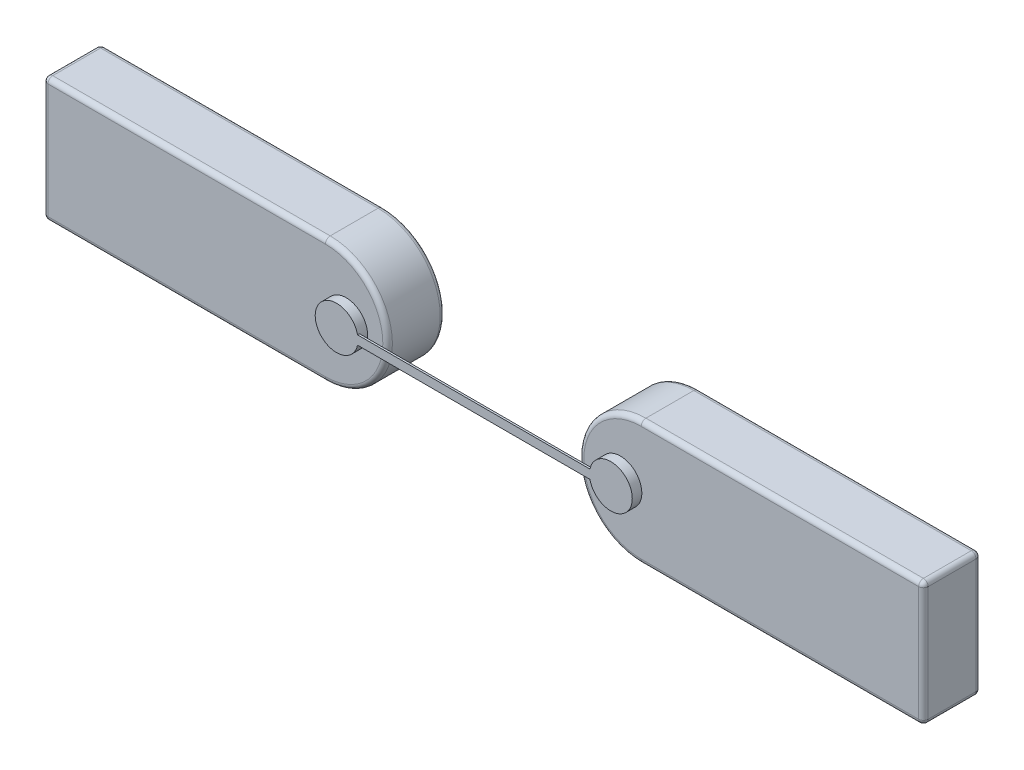
ISO-10303-21;
HEADER;
FILE_DESCRIPTION(('STEP AP214'),'2;1');
FILE_NAME('part.step','',(''),(''),'','','');
FILE_SCHEMA(('AUTOMOTIVE_DESIGN { 1 0 10303 214 1 1 1 1 }'));
ENDSEC;
DATA;
#1=APPLICATION_CONTEXT('core data for automotive mechanical design processes');
#2=APPLICATION_PROTOCOL_DEFINITION('international standard','automotive_design',2000,#1);
#3=PRODUCT_CONTEXT('',#1,'mechanical');
#4=PRODUCT('Part','Part','',(#3));
#5=PRODUCT_RELATED_PRODUCT_CATEGORY('part','',(#4));
#6=PRODUCT_DEFINITION_FORMATION('','',#4);
#7=PRODUCT_DEFINITION_CONTEXT('part definition',#1,'design');
#8=PRODUCT_DEFINITION('design','',#6,#7);
#9=PRODUCT_DEFINITION_SHAPE('','',#8);
#10=(LENGTH_UNIT() NAMED_UNIT(*) SI_UNIT(.MILLI.,.METRE.));
#11=(NAMED_UNIT(*) PLANE_ANGLE_UNIT() SI_UNIT($,.RADIAN.));
#12=(NAMED_UNIT(*) SI_UNIT($,.STERADIAN.) SOLID_ANGLE_UNIT());
#13=UNCERTAINTY_MEASURE_WITH_UNIT(LENGTH_MEASURE(1.E-05),#10,'distance_accuracy_value','');
#14=(GEOMETRIC_REPRESENTATION_CONTEXT(3) GLOBAL_UNCERTAINTY_ASSIGNED_CONTEXT((#13)) GLOBAL_UNIT_ASSIGNED_CONTEXT((#10,
#11,#12)) REPRESENTATION_CONTEXT('',''));
#15=CARTESIAN_POINT('',(0.,0.,0.));
#16=DIRECTION('',(0.,0.,1.));
#17=DIRECTION('',(1.,0.,0.));
#18=AXIS2_PLACEMENT_3D('',#15,#16,#17);
#19=CARTESIAN_POINT('',(2.275,-0.3,0.025));
#20=DIRECTION('',(1.,0.,0.));
#21=DIRECTION('',(0.,1.,0.));
#22=AXIS2_PLACEMENT_3D('',#19,#20,#21);
#23=SPHERICAL_SURFACE('',#22,0.025);
#24=CARTESIAN_POINT('',(2.275,-0.3,0.025));
#25=DIRECTION('',(1.,0.,0.));
#26=DIRECTION('',(0.,1.,0.));
#27=AXIS2_PLACEMENT_3D('',#24,#25,#26);
#28=CIRCLE('',#27,0.025);
#29=CARTESIAN_POINT('',(2.275,-0.3,0.));
#30=VERTEX_POINT('',#29);
#31=CARTESIAN_POINT('',(2.275,-0.325,0.025));
#32=VERTEX_POINT('',#31);
#33=EDGE_CURVE('E186',#30,#32,#28,.F.);
#34=ORIENTED_EDGE('',*,*,#33,.F.);
#35=CARTESIAN_POINT('',(2.275,-0.3,0.025));
#36=DIRECTION('',(0.,1.,0.));
#37=DIRECTION('',(0.,0.,1.));
#38=AXIS2_PLACEMENT_3D('',#35,#36,#37);
#39=CIRCLE('',#38,0.025);
#40=CARTESIAN_POINT('',(2.3,-0.3,0.025));
#41=VERTEX_POINT('',#40);
#42=EDGE_CURVE('E193',#41,#30,#39,.T.);
#43=ORIENTED_EDGE('',*,*,#42,.F.);
#44=CARTESIAN_POINT('',(2.275,-0.3,0.025));
#45=DIRECTION('',(0.,0.,-1.));
#46=DIRECTION('',(-1.,0.,0.));
#47=AXIS2_PLACEMENT_3D('',#44,#45,#46);
#48=CIRCLE('',#47,0.025);
#49=EDGE_CURVE('E226',#32,#41,#48,.F.);
#50=ORIENTED_EDGE('',*,*,#49,.F.);
#51=EDGE_LOOP('',(#34,#43,#50));
#52=FACE_BOUND('',#51,.T.);
#53=ADVANCED_FACE('F17',(#52),#23,.T.);
#54=CARTESIAN_POINT('',(2.275,0.3,0.025));
#55=DIRECTION('',(1.,0.,0.));
#56=DIRECTION('',(0.,0.,1.));
#57=AXIS2_PLACEMENT_3D('',#54,#55,#56);
#58=SPHERICAL_SURFACE('',#57,0.025);
#59=CARTESIAN_POINT('',(2.275,0.3,0.025));
#60=DIRECTION('',(0.,1.,0.));
#61=DIRECTION('',(0.,0.,1.));
#62=AXIS2_PLACEMENT_3D('',#59,#60,#61);
#63=CIRCLE('',#62,0.025);
#64=CARTESIAN_POINT('',(2.275,0.3,0.));
#65=VERTEX_POINT('',#64);
#66=CARTESIAN_POINT('',(2.3,0.3,0.025));
#67=VERTEX_POINT('',#66);
#68=EDGE_CURVE('E230',#65,#67,#63,.F.);
#69=ORIENTED_EDGE('',*,*,#68,.F.);
#70=CARTESIAN_POINT('',(2.275,0.3,0.025));
#71=DIRECTION('',(-1.,0.,0.));
#72=DIRECTION('',(0.,-1.,0.));
#73=AXIS2_PLACEMENT_3D('',#70,#71,#72);
#74=CIRCLE('',#73,0.025);
#75=CARTESIAN_POINT('',(2.275,0.325,0.025));
#76=VERTEX_POINT('',#75);
#77=EDGE_CURVE('E203',#76,#65,#74,.T.);
#78=ORIENTED_EDGE('',*,*,#77,.F.);
#79=CARTESIAN_POINT('',(2.275,0.3,0.025));
#80=DIRECTION('',(0.,0.,-1.));
#81=DIRECTION('',(-1.,0.,0.));
#82=AXIS2_PLACEMENT_3D('',#79,#80,#81);
#83=CIRCLE('',#82,0.025);
#84=EDGE_CURVE('E222',#67,#76,#83,.F.);
#85=ORIENTED_EDGE('',*,*,#84,.F.);
#86=EDGE_LOOP('',(#69,#78,#85));
#87=FACE_BOUND('',#86,.T.);
#88=ADVANCED_FACE('F404',(#87),#58,.T.);
#89=CARTESIAN_POINT('',(1.462069993503,0.,0.));
#90=DIRECTION('',(0.,0.,1.));
#91=DIRECTION('',(1.,0.,0.));
#92=AXIS2_PLACEMENT_3D('',#89,#90,#91);
#93=PLANE('',#92);
#94=DIRECTION('',(-1.,0.,0.));
#95=VECTOR('',#94,1.);
#96=CARTESIAN_POINT('',(1.512284996751,0.3,0.));
#97=LINE('',#96,#95);
#98=CARTESIAN_POINT('',(0.825,0.3,0.));
#99=VERTEX_POINT('',#98);
#100=EDGE_CURVE('E200',#65,#99,#97,.T.);
#101=ORIENTED_EDGE('',*,*,#100,.F.);
#102=DIRECTION('',(0.,1.,0.));
#103=VECTOR('',#102,1.);
#104=CARTESIAN_POINT('',(2.275,0.,0.));
#105=LINE('',#104,#103);
#106=EDGE_CURVE('E190',#30,#65,#105,.T.);
#107=ORIENTED_EDGE('',*,*,#106,.F.);
#108=DIRECTION('',(1.,0.,0.));
#109=VECTOR('',#108,1.);
#110=CARTESIAN_POINT('',(1.512284996751,-0.3,0.));
#111=LINE('',#110,#109);
#112=CARTESIAN_POINT('',(0.825,-0.3,0.));
#113=VERTEX_POINT('',#112);
#114=EDGE_CURVE('E188',#113,#30,#111,.T.);
#115=ORIENTED_EDGE('',*,*,#114,.F.);
#116=CARTESIAN_POINT('',(0.825,0.,0.));
#117=DIRECTION('',(0.,0.,1.));
#118=DIRECTION('',(1.,0.,0.));
#119=AXIS2_PLACEMENT_3D('',#116,#117,#118);
#120=CIRCLE('',#119,0.3);
#121=EDGE_CURVE('E21',#99,#113,#120,.T.);
#122=ORIENTED_EDGE('',*,*,#121,.F.);
#123=EDGE_LOOP('',(#101,#107,#115,#122));
#124=FACE_BOUND('',#123,.T.);
#125=ADVANCED_FACE('F189',(#124),#93,.F.);
#126=CARTESIAN_POINT('',(1.512284996751,-0.3,0.025));
#127=DIRECTION('',(1.,0.,0.));
#128=DIRECTION('',(0.,1.,0.));
#129=AXIS2_PLACEMENT_3D('',#126,#127,#128);
#130=CYLINDRICAL_SURFACE('',#129,0.025);
#131=CARTESIAN_POINT('',(0.825,-0.3,0.025));
#132=DIRECTION('',(-1.,0.,0.));
#133=DIRECTION('',(0.,0.,1.));
#134=AXIS2_PLACEMENT_3D('',#131,#132,#133);
#135=CIRCLE('',#134,0.025);
#136=CARTESIAN_POINT('',(0.825,-0.325,0.025));
#137=VERTEX_POINT('',#136);
#138=EDGE_CURVE('E182',#113,#137,#135,.T.);
#139=ORIENTED_EDGE('',*,*,#138,.F.);
#140=ORIENTED_EDGE('',*,*,#114,.T.);
#141=ORIENTED_EDGE('',*,*,#33,.T.);
#142=DIRECTION('',(1.,0.,0.));
#143=VECTOR('',#142,1.);
#144=CARTESIAN_POINT('',(1.5625,-0.325,0.025));
#145=LINE('',#144,#143);
#146=EDGE_CURVE('E198',#137,#32,#145,.T.);
#147=ORIENTED_EDGE('',*,*,#146,.F.);
#148=EDGE_LOOP('',(#139,#140,#141,#147));
#149=FACE_BOUND('',#148,.T.);
#150=ADVANCED_FACE('F196',(#149),#130,.T.);
#151=CARTESIAN_POINT('',(2.275,0.,0.025));
#152=DIRECTION('',(0.,1.,0.));
#153=DIRECTION('',(0.,0.,1.));
#154=AXIS2_PLACEMENT_3D('',#151,#152,#153);
#155=CYLINDRICAL_SURFACE('',#154,0.025);
#156=ORIENTED_EDGE('',*,*,#68,.T.);
#157=DIRECTION('',(0.,1.,0.));
#158=VECTOR('',#157,1.);
#159=CARTESIAN_POINT('',(2.3,0.,0.025));
#160=LINE('',#159,#158);
#161=EDGE_CURVE('E233',#41,#67,#160,.T.);
#162=ORIENTED_EDGE('',*,*,#161,.F.);
#163=ORIENTED_EDGE('',*,*,#42,.T.);
#164=ORIENTED_EDGE('',*,*,#106,.T.);
#165=EDGE_LOOP('',(#156,#162,#163,#164));
#166=FACE_BOUND('',#165,.T.);
#167=ADVANCED_FACE('F408',(#166),#155,.T.);
#168=CARTESIAN_POINT('',(2.275,-0.3,0.3));
#169=DIRECTION('',(0.,0.,-1.));
#170=DIRECTION('',(-1.,0.,0.));
#171=AXIS2_PLACEMENT_3D('',#168,#169,#170);
#172=CYLINDRICAL_SURFACE('',#171,0.025);
#173=ORIENTED_EDGE('',*,*,#49,.T.);
#174=DIRECTION('',(0.,0.,-1.));
#175=VECTOR('',#174,1.);
#176=CARTESIAN_POINT('',(2.3,-0.3,0.3));
#177=LINE('',#176,#175);
#178=CARTESIAN_POINT('',(2.3,-0.3,0.275));
#179=VERTEX_POINT('',#178);
#180=EDGE_CURVE('E366',#179,#41,#177,.T.);
#181=ORIENTED_EDGE('',*,*,#180,.F.);
#182=CARTESIAN_POINT('',(2.275,-0.3,0.275));
#183=DIRECTION('',(0.,0.,1.));
#184=DIRECTION('',(1.,0.,0.));
#185=AXIS2_PLACEMENT_3D('',#182,#183,#184);
#186=CIRCLE('',#185,0.025);
#187=CARTESIAN_POINT('',(2.275,-0.325,0.275));
#188=VERTEX_POINT('',#187);
#189=EDGE_CURVE('E237',#188,#179,#186,.T.);
#190=ORIENTED_EDGE('',*,*,#189,.F.);
#191=DIRECTION('',(0.,0.,1.));
#192=VECTOR('',#191,1.);
#193=CARTESIAN_POINT('',(2.275,-0.325,0.3));
#194=LINE('',#193,#192);
#195=EDGE_CURVE('E370',#32,#188,#194,.T.);
#196=ORIENTED_EDGE('',*,*,#195,.F.);
#197=EDGE_LOOP('',(#173,#181,#190,#196));
#198=FACE_BOUND('',#197,.T.);
#199=ADVANCED_FACE('F416',(#198),#172,.T.);
#200=CARTESIAN_POINT('',(2.275,0.3,0.3));
#201=DIRECTION('',(0.,0.,-1.));
#202=DIRECTION('',(-1.,0.,0.));
#203=AXIS2_PLACEMENT_3D('',#200,#201,#202);
#204=CYLINDRICAL_SURFACE('',#203,0.025);
#205=ORIENTED_EDGE('',*,*,#84,.T.);
#206=DIRECTION('',(0.,0.,1.));
#207=VECTOR('',#206,1.);
#208=CARTESIAN_POINT('',(2.275,0.325,0.3));
#209=LINE('',#208,#207);
#210=CARTESIAN_POINT('',(2.275,0.325,0.275));
#211=VERTEX_POINT('',#210);
#212=EDGE_CURVE('E217',#211,#76,#209,.F.);
#213=ORIENTED_EDGE('',*,*,#212,.F.);
#214=CARTESIAN_POINT('',(2.275,0.3,0.275));
#215=DIRECTION('',(0.,0.,1.));
#216=DIRECTION('',(1.,0.,0.));
#217=AXIS2_PLACEMENT_3D('',#214,#215,#216);
#218=CIRCLE('',#217,0.025);
#219=CARTESIAN_POINT('',(2.3,0.3,0.275));
#220=VERTEX_POINT('',#219);
#221=EDGE_CURVE('E362',#220,#211,#218,.T.);
#222=ORIENTED_EDGE('',*,*,#221,.F.);
#223=DIRECTION('',(0.,0.,-1.));
#224=VECTOR('',#223,1.);
#225=CARTESIAN_POINT('',(2.3,0.3,0.3));
#226=LINE('',#225,#224);
#227=EDGE_CURVE('E236',#67,#220,#226,.F.);
#228=ORIENTED_EDGE('',*,*,#227,.F.);
#229=EDGE_LOOP('',(#205,#213,#222,#228));
#230=FACE_BOUND('',#229,.T.);
#231=ADVANCED_FACE('F804',(#230),#204,.T.);
#232=CARTESIAN_POINT('',(1.512284996751,0.3,0.025));
#233=DIRECTION('',(-1.,0.,0.));
#234=DIRECTION('',(0.,-1.,0.));
#235=AXIS2_PLACEMENT_3D('',#232,#233,#234);
#236=CYLINDRICAL_SURFACE('',#235,0.025);
#237=CARTESIAN_POINT('',(0.825,0.3,0.025));
#238=DIRECTION('',(-1.,0.,0.));
#239=DIRECTION('',(0.,0.,1.));
#240=AXIS2_PLACEMENT_3D('',#237,#238,#239);
#241=CIRCLE('',#240,0.025);
#242=CARTESIAN_POINT('',(0.825,0.325,0.025));
#243=VERTEX_POINT('',#242);
#244=EDGE_CURVE('E185',#243,#99,#241,.T.);
#245=ORIENTED_EDGE('',*,*,#244,.F.);
#246=DIRECTION('',(-1.,0.,0.));
#247=VECTOR('',#246,1.);
#248=CARTESIAN_POINT('',(1.5625,0.325,0.025));
#249=LINE('',#248,#247);
#250=EDGE_CURVE('E213',#76,#243,#249,.T.);
#251=ORIENTED_EDGE('',*,*,#250,.F.);
#252=ORIENTED_EDGE('',*,*,#77,.T.);
#253=ORIENTED_EDGE('',*,*,#100,.T.);
#254=EDGE_LOOP('',(#245,#251,#252,#253));
#255=FACE_BOUND('',#254,.T.);
#256=ADVANCED_FACE('F400',(#255),#236,.T.);
#257=CARTESIAN_POINT('',(0.825,0.,0.025));
#258=DIRECTION('',(0.,0.,1.));
#259=DIRECTION('',(1.,0.,0.));
#260=AXIS2_PLACEMENT_3D('',#257,#258,#259);
#261=TOROIDAL_SURFACE('',#260,0.3,0.025);
#262=ORIENTED_EDGE('',*,*,#244,.T.);
#263=ORIENTED_EDGE('',*,*,#121,.T.);
#264=ORIENTED_EDGE('',*,*,#138,.T.);
#265=CARTESIAN_POINT('',(0.825,0.,0.025));
#266=DIRECTION('',(0.,0.,-1.));
#267=DIRECTION('',(-1.,0.,0.));
#268=AXIS2_PLACEMENT_3D('',#265,#266,#267);
#269=CIRCLE('',#268,0.325);
#270=EDGE_CURVE('E346',#243,#137,#269,.F.);
#271=ORIENTED_EDGE('',*,*,#270,.F.);
#272=EDGE_LOOP('',(#262,#263,#264,#271));
#273=FACE_BOUND('',#272,.T.);
#274=ADVANCED_FACE('F180',(#273),#261,.T.);
#275=CARTESIAN_POINT('',(1.5625,-0.325,0.3));
#276=DIRECTION('',(0.,-1.,0.));
#277=DIRECTION('',(1.,0.,0.));
#278=AXIS2_PLACEMENT_3D('',#275,#276,#277);
#279=PLANE('',#278);
#280=ORIENTED_EDGE('',*,*,#146,.T.);
#281=ORIENTED_EDGE('',*,*,#195,.T.);
#282=DIRECTION('',(-1.,0.,0.));
#283=VECTOR('',#282,1.);
#284=CARTESIAN_POINT('',(1.512284996751,-0.325,0.275));
#285=LINE('',#284,#283);
#286=CARTESIAN_POINT('',(0.825,-0.325,0.275));
#287=VERTEX_POINT('',#286);
#288=EDGE_CURVE('E328',#287,#188,#285,.F.);
#289=ORIENTED_EDGE('',*,*,#288,.F.);
#290=DIRECTION('',(0.,0.,-1.));
#291=VECTOR('',#290,1.);
#292=CARTESIAN_POINT('',(0.825,-0.325,0.3));
#293=LINE('',#292,#291);
#294=EDGE_CURVE('E337',#137,#287,#293,.F.);
#295=ORIENTED_EDGE('',*,*,#294,.F.);
#296=EDGE_LOOP('',(#280,#281,#289,#295));
#297=FACE_BOUND('',#296,.T.);
#298=ADVANCED_FACE('F423',(#297),#279,.T.);
#299=CARTESIAN_POINT('',(2.275,-0.3,0.275));
#300=DIRECTION('',(1.,0.,0.));
#301=DIRECTION('',(0.,0.,-1.));
#302=AXIS2_PLACEMENT_3D('',#299,#300,#301);
#303=SPHERICAL_SURFACE('',#302,0.0249999999999999);
#304=CARTESIAN_POINT('',(2.275,-0.3,0.275));
#305=DIRECTION('',(-1.,0.,0.));
#306=DIRECTION('',(0.,-1.,0.));
#307=AXIS2_PLACEMENT_3D('',#304,#305,#306);
#308=CIRCLE('',#307,0.025);
#309=CARTESIAN_POINT('',(2.275,-0.3,0.3));
#310=VERTEX_POINT('',#309);
#311=EDGE_CURVE('E335',#188,#310,#308,.T.);
#312=ORIENTED_EDGE('',*,*,#311,.F.);
#313=ORIENTED_EDGE('',*,*,#189,.T.);
#314=CARTESIAN_POINT('',(2.275,-0.3,0.275));
#315=DIRECTION('',(0.,-1.,0.));
#316=DIRECTION('',(0.,0.,-1.));
#317=AXIS2_PLACEMENT_3D('',#314,#315,#316);
#318=CIRCLE('',#317,0.025);
#319=EDGE_CURVE('E327',#310,#179,#318,.F.);
#320=ORIENTED_EDGE('',*,*,#319,.F.);
#321=EDGE_LOOP('',(#312,#313,#320));
#322=FACE_BOUND('',#321,.T.);
#323=ADVANCED_FACE('F435',(#322),#303,.T.);
#324=CARTESIAN_POINT('',(2.3,0.,0.3));
#325=DIRECTION('',(1.,0.,0.));
#326=DIRECTION('',(0.,0.,-1.));
#327=AXIS2_PLACEMENT_3D('',#324,#325,#326);
#328=PLANE('',#327);
#329=DIRECTION('',(0.,-1.,0.));
#330=VECTOR('',#329,1.);
#331=CARTESIAN_POINT('',(2.3,0.,0.275));
#332=LINE('',#331,#330);
#333=EDGE_CURVE('E320',#179,#220,#332,.F.);
#334=ORIENTED_EDGE('',*,*,#333,.F.);
#335=ORIENTED_EDGE('',*,*,#180,.T.);
#336=ORIENTED_EDGE('',*,*,#161,.T.);
#337=ORIENTED_EDGE('',*,*,#227,.T.);
#338=EDGE_LOOP('',(#334,#335,#336,#337));
#339=FACE_BOUND('',#338,.T.);
#340=ADVANCED_FACE('F411',(#339),#328,.T.);
#341=CARTESIAN_POINT('',(2.275,0.3,0.275));
#342=DIRECTION('',(1.,0.,0.));
#343=DIRECTION('',(0.,-1.,0.));
#344=AXIS2_PLACEMENT_3D('',#341,#342,#343);
#345=SPHERICAL_SURFACE('',#344,0.025);
#346=CARTESIAN_POINT('',(2.275,0.3,0.275));
#347=DIRECTION('',(0.,-1.,0.));
#348=DIRECTION('',(0.,0.,-1.));
#349=AXIS2_PLACEMENT_3D('',#346,#347,#348);
#350=CIRCLE('',#349,0.025);
#351=CARTESIAN_POINT('',(2.275,0.3,0.3));
#352=VERTEX_POINT('',#351);
#353=EDGE_CURVE('E325',#220,#352,#350,.T.);
#354=ORIENTED_EDGE('',*,*,#353,.F.);
#355=ORIENTED_EDGE('',*,*,#221,.T.);
#356=CARTESIAN_POINT('',(2.275,0.3,0.275));
#357=DIRECTION('',(1.,0.,0.));
#358=DIRECTION('',(0.,1.,0.));
#359=AXIS2_PLACEMENT_3D('',#356,#357,#358);
#360=CIRCLE('',#359,0.025);
#361=EDGE_CURVE('E317',#352,#211,#360,.F.);
#362=ORIENTED_EDGE('',*,*,#361,.F.);
#363=EDGE_LOOP('',(#354,#355,#362));
#364=FACE_BOUND('',#363,.T.);
#365=ADVANCED_FACE('F440',(#364),#345,.T.);
#366=CARTESIAN_POINT('',(1.5625,0.325,0.3));
#367=DIRECTION('',(0.,1.,0.));
#368=DIRECTION('',(-1.,0.,0.));
#369=AXIS2_PLACEMENT_3D('',#366,#367,#368);
#370=PLANE('',#369);
#371=ORIENTED_EDGE('',*,*,#250,.T.);
#372=DIRECTION('',(0.,0.,-1.));
#373=VECTOR('',#372,1.);
#374=CARTESIAN_POINT('',(0.825,0.325,0.3));
#375=LINE('',#374,#373);
#376=CARTESIAN_POINT('',(0.825,0.325,0.275));
#377=VERTEX_POINT('',#376);
#378=EDGE_CURVE('E216',#377,#243,#375,.T.);
#379=ORIENTED_EDGE('',*,*,#378,.F.);
#380=DIRECTION('',(1.,0.,0.));
#381=VECTOR('',#380,1.);
#382=CARTESIAN_POINT('',(1.512284996751,0.325,0.275));
#383=LINE('',#382,#381);
#384=EDGE_CURVE('E310',#211,#377,#383,.F.);
#385=ORIENTED_EDGE('',*,*,#384,.F.);
#386=ORIENTED_EDGE('',*,*,#212,.T.);
#387=EDGE_LOOP('',(#371,#379,#385,#386));
#388=FACE_BOUND('',#387,.T.);
#389=ADVANCED_FACE('F395',(#388),#370,.T.);
#390=CARTESIAN_POINT('',(0.825,0.,0.3));
#391=DIRECTION('',(0.,0.,-1.));
#392=DIRECTION('',(-1.,0.,0.));
#393=AXIS2_PLACEMENT_3D('',#390,#391,#392);
#394=CYLINDRICAL_SURFACE('',#393,0.325);
#395=ORIENTED_EDGE('',*,*,#270,.T.);
#396=ORIENTED_EDGE('',*,*,#294,.T.);
#397=CARTESIAN_POINT('',(0.825,0.,0.275));
#398=DIRECTION('',(0.,0.,1.));
#399=DIRECTION('',(1.,0.,0.));
#400=AXIS2_PLACEMENT_3D('',#397,#398,#399);
#401=CIRCLE('',#400,0.325);
#402=EDGE_CURVE('E304',#377,#287,#401,.T.);
#403=ORIENTED_EDGE('',*,*,#402,.F.);
#404=ORIENTED_EDGE('',*,*,#378,.T.);
#405=EDGE_LOOP('',(#395,#396,#403,#404));
#406=FACE_BOUND('',#405,.T.);
#407=ADVANCED_FACE('F390',(#406),#394,.T.);
#408=CARTESIAN_POINT('',(1.512284996751,-0.3,0.275));
#409=DIRECTION('',(-1.,0.,0.));
#410=DIRECTION('',(0.,-1.,0.));
#411=AXIS2_PLACEMENT_3D('',#408,#409,#410);
#412=CYLINDRICAL_SURFACE('',#411,0.025);
#413=CARTESIAN_POINT('',(0.825,-0.3,0.275));
#414=DIRECTION('',(-1.,0.,0.));
#415=DIRECTION('',(0.,0.,1.));
#416=AXIS2_PLACEMENT_3D('',#413,#414,#415);
#417=CIRCLE('',#416,0.025);
#418=CARTESIAN_POINT('',(0.825,-0.3,0.3));
#419=VERTEX_POINT('',#418);
#420=EDGE_CURVE('E307',#287,#419,#417,.T.);
#421=ORIENTED_EDGE('',*,*,#420,.F.);
#422=ORIENTED_EDGE('',*,*,#288,.T.);
#423=ORIENTED_EDGE('',*,*,#311,.T.);
#424=DIRECTION('',(1.,0.,0.));
#425=VECTOR('',#424,1.);
#426=CARTESIAN_POINT('',(1.462069993503,-0.3,0.3));
#427=LINE('',#426,#425);
#428=EDGE_CURVE('E296',#419,#310,#427,.T.);
#429=ORIENTED_EDGE('',*,*,#428,.F.);
#430=EDGE_LOOP('',(#421,#422,#423,#429));
#431=FACE_BOUND('',#430,.T.);
#432=ADVANCED_FACE('F429',(#431),#412,.T.);
#433=CARTESIAN_POINT('',(2.275,0.,0.275));
#434=DIRECTION('',(0.,-1.,0.));
#435=DIRECTION('',(0.,0.,-1.));
#436=AXIS2_PLACEMENT_3D('',#433,#434,#435);
#437=CYLINDRICAL_SURFACE('',#436,0.025);
#438=ORIENTED_EDGE('',*,*,#319,.T.);
#439=ORIENTED_EDGE('',*,*,#333,.T.);
#440=ORIENTED_EDGE('',*,*,#353,.T.);
#441=DIRECTION('',(0.,1.,0.));
#442=VECTOR('',#441,1.);
#443=CARTESIAN_POINT('',(2.275,0.,0.3));
#444=LINE('',#443,#442);
#445=EDGE_CURVE('E291',#310,#352,#444,.T.);
#446=ORIENTED_EDGE('',*,*,#445,.F.);
#447=EDGE_LOOP('',(#438,#439,#440,#446));
#448=FACE_BOUND('',#447,.T.);
#449=ADVANCED_FACE('F437',(#448),#437,.T.);
#450=CARTESIAN_POINT('',(1.512284996751,0.3,0.275));
#451=DIRECTION('',(1.,0.,0.));
#452=DIRECTION('',(0.,1.,0.));
#453=AXIS2_PLACEMENT_3D('',#450,#451,#452);
#454=CYLINDRICAL_SURFACE('',#453,0.025);
#455=CARTESIAN_POINT('',(0.825,0.3,0.275));
#456=DIRECTION('',(-1.,0.,0.));
#457=DIRECTION('',(0.,0.,1.));
#458=AXIS2_PLACEMENT_3D('',#455,#456,#457);
#459=CIRCLE('',#458,0.025);
#460=CARTESIAN_POINT('',(0.825,0.3,0.3));
#461=VERTEX_POINT('',#460);
#462=EDGE_CURVE('E309',#461,#377,#459,.T.);
#463=ORIENTED_EDGE('',*,*,#462,.F.);
#464=DIRECTION('',(1.,0.,0.));
#465=VECTOR('',#464,1.);
#466=CARTESIAN_POINT('',(1.462069993503,0.3,0.3));
#467=LINE('',#466,#465);
#468=EDGE_CURVE('E286',#352,#461,#467,.F.);
#469=ORIENTED_EDGE('',*,*,#468,.F.);
#470=ORIENTED_EDGE('',*,*,#361,.T.);
#471=ORIENTED_EDGE('',*,*,#384,.T.);
#472=EDGE_LOOP('',(#463,#469,#470,#471));
#473=FACE_BOUND('',#472,.T.);
#474=ADVANCED_FACE('F442',(#473),#454,.T.);
#475=CARTESIAN_POINT('',(0.825,0.,0.275));
#476=DIRECTION('',(0.,0.,-1.));
#477=DIRECTION('',(-1.,0.,0.));
#478=AXIS2_PLACEMENT_3D('',#475,#476,#477);
#479=TOROIDAL_SURFACE('',#478,0.3,0.025);
#480=ORIENTED_EDGE('',*,*,#462,.T.);
#481=ORIENTED_EDGE('',*,*,#402,.T.);
#482=ORIENTED_EDGE('',*,*,#420,.T.);
#483=CARTESIAN_POINT('',(0.825,0.,0.3));
#484=DIRECTION('',(0.,0.,-1.));
#485=DIRECTION('',(-1.,0.,0.));
#486=AXIS2_PLACEMENT_3D('',#483,#484,#485);
#487=CIRCLE('',#486,0.3);
#488=EDGE_CURVE('E284',#461,#419,#487,.F.);
#489=ORIENTED_EDGE('',*,*,#488,.F.);
#490=EDGE_LOOP('',(#480,#481,#482,#489));
#491=FACE_BOUND('',#490,.T.);
#492=ADVANCED_FACE('F428',(#491),#479,.T.);
#493=CARTESIAN_POINT('',(1.462069993503,0.,0.3));
#494=DIRECTION('',(0.,0.,1.));
#495=DIRECTION('',(1.,0.,0.));
#496=AXIS2_PLACEMENT_3D('',#493,#494,#495);
#497=PLANE('',#496);
#498=CARTESIAN_POINT('',(0.716666728258,0.,0.3));
#499=DIRECTION('',(0.,0.,1.));
#500=DIRECTION('',(0.,-1.,0.));
#501=AXIS2_PLACEMENT_3D('',#498,#499,#500);
#502=CIRCLE('',#501,0.111803283921);
#503=CARTESIAN_POINT('',(0.716666728258,-0.111803283921,0.3));
#504=VERTEX_POINT('',#503);
#505=EDGE_CURVE('E282',#504,#504,#502,.T.);
#506=ORIENTED_EDGE('',*,*,#505,.F.);
#507=EDGE_LOOP('',(#506));
#508=FACE_BOUND('',#507,.T.);
#509=ORIENTED_EDGE('',*,*,#468,.T.);
#510=ORIENTED_EDGE('',*,*,#488,.T.);
#511=ORIENTED_EDGE('',*,*,#428,.T.);
#512=ORIENTED_EDGE('',*,*,#445,.T.);
#513=EDGE_LOOP('',(#509,#510,#511,#512));
#514=FACE_BOUND('',#513,.T.);
#515=ADVANCED_FACE('F431',(#508,#514),#497,.T.);
#516=CARTESIAN_POINT('',(0.716666728258,0.,0.3));
#517=DIRECTION('',(0.,0.,1.));
#518=DIRECTION('',(0.,-1.,0.));
#519=AXIS2_PLACEMENT_3D('',#516,#517,#518);
#520=CYLINDRICAL_SURFACE('',#519,0.111803283921);
#521=DIRECTION('',(0.,0.,1.));
#522=VECTOR('',#521,1.);
#523=CARTESIAN_POINT('',(0.607325378039,0.02333331154659,0.35));
#524=LINE('',#523,#522);
#525=CARTESIAN_POINT('',(0.607325378038827,0.02333331154659,0.35));
#526=VERTEX_POINT('',#525);
#527=CARTESIAN_POINT('',(0.607325378038827,0.02333331154659,0.34));
#528=VERTEX_POINT('',#527);
#529=EDGE_CURVE('E281',#526,#528,#524,.F.);
#530=ORIENTED_EDGE('',*,*,#529,.F.);
#531=CARTESIAN_POINT('',(0.716666728258,0.,0.35));
#532=DIRECTION('',(0.,0.,1.));
#533=DIRECTION('',(0.,-1.,0.));
#534=AXIS2_PLACEMENT_3D('',#531,#532,#533);
#535=CIRCLE('',#534,0.111803283921);
#536=CARTESIAN_POINT('',(0.607325378038827,-0.02333331154659,0.35));
#537=VERTEX_POINT('',#536);
#538=EDGE_CURVE('E274',#537,#526,#535,.T.);
#539=ORIENTED_EDGE('',*,*,#538,.F.);
#540=DIRECTION('',(0.,0.,-1.));
#541=VECTOR('',#540,1.);
#542=CARTESIAN_POINT('',(0.607325378039,-0.02333331154659,0.35));
#543=LINE('',#542,#541);
#544=CARTESIAN_POINT('',(0.607325378038827,-0.02333331154659,0.34));
#545=VERTEX_POINT('',#544);
#546=EDGE_CURVE('E1041',#545,#537,#543,.F.);
#547=ORIENTED_EDGE('',*,*,#546,.F.);
#548=CARTESIAN_POINT('',(0.716666728258,0.,0.34));
#549=DIRECTION('',(0.,0.,1.));
#550=DIRECTION('',(0.,-1.,0.));
#551=AXIS2_PLACEMENT_3D('',#548,#549,#550);
#552=CIRCLE('',#551,0.111803283921);
#553=EDGE_CURVE('E277',#545,#528,#552,.F.);
#554=ORIENTED_EDGE('',*,*,#553,.T.);
#555=EDGE_LOOP('',(#530,#539,#547,#554));
#556=FACE_BOUND('',#555,.T.);
#557=ORIENTED_EDGE('',*,*,#505,.T.);
#558=EDGE_LOOP('',(#557));
#559=FACE_BOUND('',#558,.T.);
#560=ADVANCED_FACE('F536',(#556,#559),#520,.T.);
#561=CARTESIAN_POINT('',(0.008333325386047,0.02333331154659,0.35));
#562=DIRECTION('',(0.,1.,0.));
#563=DIRECTION('',(0.,0.,1.));
#564=AXIS2_PLACEMENT_3D('',#561,#562,#563);
#565=PLANE('',#564);
#566=DIRECTION('',(0.,0.,1.));
#567=VECTOR('',#566,1.);
#568=CARTESIAN_POINT('',(-0.60732537803867,0.0233333115466605,0.3));
#569=LINE('',#568,#567);
#570=CARTESIAN_POINT('',(-0.607325378038662,0.0233333115466252,0.35));
#571=VERTEX_POINT('',#570);
#572=CARTESIAN_POINT('',(-0.607325378038662,0.0233333115466252,0.34));
#573=VERTEX_POINT('',#572);
#574=EDGE_CURVE('E273',#571,#573,#569,.F.);
#575=ORIENTED_EDGE('',*,*,#574,.F.);
#576=DIRECTION('',(1.,0.,0.));
#577=VECTOR('',#576,1.);
#578=CARTESIAN_POINT('',(-0.716666728258,0.02333331154659,0.35));
#579=LINE('',#578,#577);
#580=EDGE_CURVE('E1033',#526,#571,#579,.F.);
#581=ORIENTED_EDGE('',*,*,#580,.F.);
#582=ORIENTED_EDGE('',*,*,#529,.T.);
#583=DIRECTION('',(1.,0.,0.));
#584=VECTOR('',#583,1.);
#585=CARTESIAN_POINT('',(0.008333325386047,0.02333331154659,0.34));
#586=LINE('',#585,#584);
#587=EDGE_CURVE('E280',#528,#573,#586,.F.);
#588=ORIENTED_EDGE('',*,*,#587,.T.);
#589=EDGE_LOOP('',(#575,#581,#582,#588));
#590=FACE_BOUND('',#589,.T.);
#591=ADVANCED_FACE('F532',(#590),#565,.T.);
#592=CARTESIAN_POINT('',(0.008333325386047,0.,0.34));
#593=DIRECTION('',(0.,0.,1.));
#594=DIRECTION('',(1.,0.,0.));
#595=AXIS2_PLACEMENT_3D('',#592,#593,#594);
#596=PLANE('',#595);
#597=ORIENTED_EDGE('',*,*,#553,.F.);
#598=DIRECTION('',(1.,0.,0.));
#599=VECTOR('',#598,1.);
#600=CARTESIAN_POINT('',(0.008333325386047,-0.02333331154659,0.34));
#601=LINE('',#600,#599);
#602=CARTESIAN_POINT('',(-0.607325378038662,-0.0233333115466252,0.34));
#603=VERTEX_POINT('',#602);
#604=EDGE_CURVE('E1036',#603,#545,#601,.T.);
#605=ORIENTED_EDGE('',*,*,#604,.F.);
#606=CARTESIAN_POINT('',(-0.716666728258,0.,0.34));
#607=DIRECTION('',(0.,0.,1.));
#608=DIRECTION('',(0.,-1.,0.));
#609=AXIS2_PLACEMENT_3D('',#606,#607,#608);
#610=CIRCLE('',#609,0.111803283921);
#611=EDGE_CURVE('E271',#573,#603,#610,.F.);
#612=ORIENTED_EDGE('',*,*,#611,.F.);
#613=ORIENTED_EDGE('',*,*,#587,.F.);
#614=EDGE_LOOP('',(#597,#605,#612,#613));
#615=FACE_BOUND('',#614,.T.);
#616=ADVANCED_FACE('F528',(#615),#596,.F.);
#617=CARTESIAN_POINT('',(0.008333325386047,-0.02333331154659,0.35));
#618=DIRECTION('',(0.,-1.,0.));
#619=DIRECTION('',(0.,0.,-1.));
#620=AXIS2_PLACEMENT_3D('',#617,#618,#619);
#621=PLANE('',#620);
#622=DIRECTION('',(0.,0.,1.));
#623=VECTOR('',#622,1.);
#624=CARTESIAN_POINT('',(-0.60732537803867,-0.0233333115466604,0.3));
#625=LINE('',#624,#623);
#626=CARTESIAN_POINT('',(-0.607325378038662,-0.0233333115466252,0.35));
#627=VERTEX_POINT('',#626);
#628=EDGE_CURVE('E270',#603,#627,#625,.T.);
#629=ORIENTED_EDGE('',*,*,#628,.F.);
#630=ORIENTED_EDGE('',*,*,#604,.T.);
#631=ORIENTED_EDGE('',*,*,#546,.T.);
#632=DIRECTION('',(1.,0.,0.));
#633=VECTOR('',#632,1.);
#634=CARTESIAN_POINT('',(-0.716666728258,-0.02333331154659,0.35));
#635=LINE('',#634,#633);
#636=EDGE_CURVE('E276',#627,#537,#635,.T.);
#637=ORIENTED_EDGE('',*,*,#636,.F.);
#638=EDGE_LOOP('',(#629,#630,#631,#637));
#639=FACE_BOUND('',#638,.T.);
#640=ADVANCED_FACE('F524',(#639),#621,.T.);
#641=CARTESIAN_POINT('',(-0.716666728258,0.,0.35));
#642=DIRECTION('',(0.,0.,1.));
#643=DIRECTION('',(0.,-1.,0.));
#644=AXIS2_PLACEMENT_3D('',#641,#642,#643);
#645=PLANE('',#644);
#646=ORIENTED_EDGE('',*,*,#636,.T.);
#647=ORIENTED_EDGE('',*,*,#538,.T.);
#648=ORIENTED_EDGE('',*,*,#580,.T.);
#649=CARTESIAN_POINT('',(-0.716666728258,0.,0.35));
#650=DIRECTION('',(0.,0.,1.));
#651=DIRECTION('',(0.,-1.,0.));
#652=AXIS2_PLACEMENT_3D('',#649,#650,#651);
#653=CIRCLE('',#652,0.111803283921);
#654=EDGE_CURVE('E268',#627,#571,#653,.F.);
#655=ORIENTED_EDGE('',*,*,#654,.F.);
#656=EDGE_LOOP('',(#646,#647,#648,#655));
#657=FACE_BOUND('',#656,.T.);
#658=ADVANCED_FACE('F520',(#657),#645,.T.);
#659=CARTESIAN_POINT('',(-0.716666728258,0.,0.3));
#660=DIRECTION('',(0.,0.,1.));
#661=DIRECTION('',(0.,-1.,0.));
#662=AXIS2_PLACEMENT_3D('',#659,#660,#661);
#663=CYLINDRICAL_SURFACE('',#662,0.111803283921);
#664=CARTESIAN_POINT('',(-0.716666728258,0.,0.3));
#665=DIRECTION('',(0.,0.,1.));
#666=DIRECTION('',(0.,-1.,0.));
#667=AXIS2_PLACEMENT_3D('',#664,#665,#666);
#668=CIRCLE('',#667,0.111803283921);
#669=CARTESIAN_POINT('',(-0.716666728258,-0.111803283921,0.3));
#670=VERTEX_POINT('',#669);
#671=EDGE_CURVE('E263',#670,#670,#668,.F.);
#672=ORIENTED_EDGE('',*,*,#671,.F.);
#673=EDGE_LOOP('',(#672));
#674=FACE_BOUND('',#673,.T.);
#675=ORIENTED_EDGE('',*,*,#654,.T.);
#676=ORIENTED_EDGE('',*,*,#574,.T.);
#677=ORIENTED_EDGE('',*,*,#611,.T.);
#678=ORIENTED_EDGE('',*,*,#628,.T.);
#679=EDGE_LOOP('',(#675,#676,#677,#678));
#680=FACE_BOUND('',#679,.T.);
#681=ADVANCED_FACE('F516',(#674,#680),#663,.T.);
#682=CARTESIAN_POINT('',(-1.462069993503,0.,0.3));
#683=DIRECTION('',(0.,0.,1.));
#684=DIRECTION('',(0.,-1.,0.));
#685=AXIS2_PLACEMENT_3D('',#682,#683,#684);
#686=PLANE('',#685);
#687=ORIENTED_EDGE('',*,*,#671,.T.);
#688=EDGE_LOOP('',(#687));
#689=FACE_BOUND('',#688,.T.);
#690=DIRECTION('',(0.,-1.,0.));
#691=VECTOR('',#690,1.);
#692=CARTESIAN_POINT('',(-2.275,0.,0.3));
#693=LINE('',#692,#691);
#694=CARTESIAN_POINT('',(-2.275,0.3,0.3));
#695=VERTEX_POINT('',#694);
#696=CARTESIAN_POINT('',(-2.275,-0.3,0.3));
#697=VERTEX_POINT('',#696);
#698=EDGE_CURVE('E267',#695,#697,#693,.T.);
#699=ORIENTED_EDGE('',*,*,#698,.T.);
#700=DIRECTION('',(1.,0.,0.));
#701=VECTOR('',#700,1.);
#702=CARTESIAN_POINT('',(-1.512284996751,-0.3,0.3));
#703=LINE('',#702,#701);
#704=CARTESIAN_POINT('',(-0.825,-0.3,0.3));
#705=VERTEX_POINT('',#704);
#706=EDGE_CURVE('E1015',#705,#697,#703,.F.);
#707=ORIENTED_EDGE('',*,*,#706,.F.);
#708=CARTESIAN_POINT('',(-0.825,0.,0.3));
#709=DIRECTION('',(0.,0.,-1.));
#710=DIRECTION('',(-1.,0.,0.));
#711=AXIS2_PLACEMENT_3D('',#708,#709,#710);
#712=CIRCLE('',#711,0.3);
#713=CARTESIAN_POINT('',(-0.825,0.3,0.3));
#714=VERTEX_POINT('',#713);
#715=EDGE_CURVE('E259',#714,#705,#712,.T.);
#716=ORIENTED_EDGE('',*,*,#715,.F.);
#717=DIRECTION('',(-1.,0.,0.));
#718=VECTOR('',#717,1.);
#719=CARTESIAN_POINT('',(-1.512284996751,0.3,0.3));
#720=LINE('',#719,#718);
#721=EDGE_CURVE('E1003',#695,#714,#720,.F.);
#722=ORIENTED_EDGE('',*,*,#721,.F.);
#723=EDGE_LOOP('',(#699,#707,#716,#722));
#724=FACE_BOUND('',#723,.T.);
#725=ADVANCED_FACE('F512',(#689,#724),#686,.T.);
#726=CARTESIAN_POINT('',(-2.275,-0.3,0.275));
#727=DIRECTION('',(1.,0.,0.));
#728=DIRECTION('',(0.,0.,1.));
#729=AXIS2_PLACEMENT_3D('',#726,#727,#728);
#730=SPHERICAL_SURFACE('',#729,0.0249999999999999);
#731=CARTESIAN_POINT('',(-2.275,-0.3,0.275));
#732=DIRECTION('',(0.,0.,-1.));
#733=DIRECTION('',(-1.,0.,0.));
#734=AXIS2_PLACEMENT_3D('',#731,#732,#733);
#735=CIRCLE('',#734,0.025);
#736=CARTESIAN_POINT('',(-2.275,-0.325,0.275));
#737=VERTEX_POINT('',#736);
#738=CARTESIAN_POINT('',(-2.3,-0.3,0.275));
#739=VERTEX_POINT('',#738);
#740=EDGE_CURVE('E984',#737,#739,#735,.T.);
#741=ORIENTED_EDGE('',*,*,#740,.F.);
#742=CARTESIAN_POINT('',(-2.275,-0.3,0.275));
#743=DIRECTION('',(1.,0.,0.));
#744=DIRECTION('',(0.,1.,0.));
#745=AXIS2_PLACEMENT_3D('',#742,#743,#744);
#746=CIRCLE('',#745,0.025);
#747=EDGE_CURVE('E266',#697,#737,#746,.T.);
#748=ORIENTED_EDGE('',*,*,#747,.F.);
#749=CARTESIAN_POINT('',(-2.275,-0.3,0.275));
#750=DIRECTION('',(0.,-1.,0.));
#751=DIRECTION('',(0.,0.,-1.));
#752=AXIS2_PLACEMENT_3D('',#749,#750,#751);
#753=CIRCLE('',#752,0.025);
#754=EDGE_CURVE('E975',#739,#697,#753,.F.);
#755=ORIENTED_EDGE('',*,*,#754,.F.);
#756=EDGE_LOOP('',(#741,#748,#755));
#757=FACE_BOUND('',#756,.T.);
#758=ADVANCED_FACE('F515',(#757),#730,.T.);
#759=CARTESIAN_POINT('',(-2.275,0.3,0.275));
#760=DIRECTION('',(1.,0.,0.));
#761=DIRECTION('',(0.,1.,0.));
#762=AXIS2_PLACEMENT_3D('',#759,#760,#761);
#763=SPHERICAL_SURFACE('',#762,0.025);
#764=CARTESIAN_POINT('',(-2.275,0.3,0.275));
#765=DIRECTION('',(-1.,0.,0.));
#766=DIRECTION('',(0.,-1.,0.));
#767=AXIS2_PLACEMENT_3D('',#764,#765,#766);
#768=CIRCLE('',#767,0.025);
#769=CARTESIAN_POINT('',(-2.275,0.325,0.275));
#770=VERTEX_POINT('',#769);
#771=EDGE_CURVE('E261',#770,#695,#768,.F.);
#772=ORIENTED_EDGE('',*,*,#771,.F.);
#773=CARTESIAN_POINT('',(-2.275,0.3,0.275));
#774=DIRECTION('',(0.,0.,-1.));
#775=DIRECTION('',(-1.,0.,0.));
#776=AXIS2_PLACEMENT_3D('',#773,#774,#775);
#777=CIRCLE('',#776,0.025);
#778=CARTESIAN_POINT('',(-2.3,0.3,0.275));
#779=VERTEX_POINT('',#778);
#780=EDGE_CURVE('E973',#779,#770,#777,.T.);
#781=ORIENTED_EDGE('',*,*,#780,.F.);
#782=CARTESIAN_POINT('',(-2.275,0.3,0.275));
#783=DIRECTION('',(0.,-1.,0.));
#784=DIRECTION('',(0.,0.,-1.));
#785=AXIS2_PLACEMENT_3D('',#782,#783,#784);
#786=CIRCLE('',#785,0.025);
#787=EDGE_CURVE('E982',#695,#779,#786,.T.);
#788=ORIENTED_EDGE('',*,*,#787,.F.);
#789=EDGE_LOOP('',(#772,#781,#788));
#790=FACE_BOUND('',#789,.T.);
#791=ADVANCED_FACE('F510',(#790),#763,.T.);
#792=CARTESIAN_POINT('',(-1.512284996751,-0.3,0.275));
#793=DIRECTION('',(1.,0.,0.));
#794=DIRECTION('',(0.,1.,0.));
#795=AXIS2_PLACEMENT_3D('',#792,#793,#794);
#796=CYLINDRICAL_SURFACE('',#795,0.025);
#797=CARTESIAN_POINT('',(-0.825,-0.3,0.275));
#798=DIRECTION('',(1.,0.,0.));
#799=DIRECTION('',(0.,0.,-1.));
#800=AXIS2_PLACEMENT_3D('',#797,#798,#799);
#801=CIRCLE('',#800,0.025);
#802=CARTESIAN_POINT('',(-0.825,-0.325,0.275));
#803=VERTEX_POINT('',#802);
#804=EDGE_CURVE('E262',#705,#803,#801,.T.);
#805=ORIENTED_EDGE('',*,*,#804,.F.);
#806=ORIENTED_EDGE('',*,*,#706,.T.);
#807=ORIENTED_EDGE('',*,*,#747,.T.);
#808=DIRECTION('',(1.,0.,0.));
#809=VECTOR('',#808,1.);
#810=CARTESIAN_POINT('',(-1.5625,-0.325,0.275));
#811=LINE('',#810,#809);
#812=EDGE_CURVE('E970',#803,#737,#811,.F.);
#813=ORIENTED_EDGE('',*,*,#812,.F.);
#814=EDGE_LOOP('',(#805,#806,#807,#813));
#815=FACE_BOUND('',#814,.T.);
#816=ADVANCED_FACE('F507',(#815),#796,.T.);
#817=CARTESIAN_POINT('',(-0.825,0.,0.275));
#818=DIRECTION('',(0.,0.,-1.));
#819=DIRECTION('',(-1.,0.,0.));
#820=AXIS2_PLACEMENT_3D('',#817,#818,#819);
#821=TOROIDAL_SURFACE('',#820,0.3,0.025);
#822=CARTESIAN_POINT('',(-0.825,0.3,0.275));
#823=DIRECTION('',(-1.,0.,0.));
#824=DIRECTION('',(0.,-1.,0.));
#825=AXIS2_PLACEMENT_3D('',#822,#823,#824);
#826=CIRCLE('',#825,0.025);
#827=CARTESIAN_POINT('',(-0.825,0.325,0.275));
#828=VERTEX_POINT('',#827);
#829=EDGE_CURVE('E992',#714,#828,#826,.T.);
#830=ORIENTED_EDGE('',*,*,#829,.F.);
#831=ORIENTED_EDGE('',*,*,#715,.T.);
#832=ORIENTED_EDGE('',*,*,#804,.T.);
#833=CARTESIAN_POINT('',(-0.825,0.,0.275));
#834=DIRECTION('',(0.,0.,-1.));
#835=DIRECTION('',(-1.,0.,0.));
#836=AXIS2_PLACEMENT_3D('',#833,#834,#835);
#837=CIRCLE('',#836,0.325);
#838=EDGE_CURVE('E965',#828,#803,#837,.T.);
#839=ORIENTED_EDGE('',*,*,#838,.F.);
#840=EDGE_LOOP('',(#830,#831,#832,#839));
#841=FACE_BOUND('',#840,.T.);
#842=ADVANCED_FACE('F505',(#841),#821,.T.);
#843=CARTESIAN_POINT('',(-1.512284996751,0.3,0.275));
#844=DIRECTION('',(-1.,0.,0.));
#845=DIRECTION('',(0.,-1.,0.));
#846=AXIS2_PLACEMENT_3D('',#843,#844,#845);
#847=CYLINDRICAL_SURFACE('',#846,0.025);
#848=ORIENTED_EDGE('',*,*,#829,.T.);
#849=DIRECTION('',(-1.,0.,0.));
#850=VECTOR('',#849,1.);
#851=CARTESIAN_POINT('',(-1.5625,0.325,0.275));
#852=LINE('',#851,#850);
#853=EDGE_CURVE('E955',#770,#828,#852,.F.);
#854=ORIENTED_EDGE('',*,*,#853,.F.);
#855=ORIENTED_EDGE('',*,*,#771,.T.);
#856=ORIENTED_EDGE('',*,*,#721,.T.);
#857=EDGE_LOOP('',(#848,#854,#855,#856));
#858=FACE_BOUND('',#857,.T.);
#859=ADVANCED_FACE('F501',(#858),#847,.T.);
#860=CARTESIAN_POINT('',(-2.275,-0.3,0.3));
#861=DIRECTION('',(0.,0.,-1.));
#862=DIRECTION('',(-1.,0.,0.));
#863=AXIS2_PLACEMENT_3D('',#860,#861,#862);
#864=CYLINDRICAL_SURFACE('',#863,0.025);
#865=CARTESIAN_POINT('',(-2.275,-0.3,0.025));
#866=DIRECTION('',(0.,0.,-1.));
#867=DIRECTION('',(-1.,0.,0.));
#868=AXIS2_PLACEMENT_3D('',#865,#866,#867);
#869=CIRCLE('',#868,0.025);
#870=CARTESIAN_POINT('',(-2.275,-0.325,0.025));
#871=VERTEX_POINT('',#870);
#872=CARTESIAN_POINT('',(-2.3,-0.3,0.025));
#873=VERTEX_POINT('',#872);
#874=EDGE_CURVE('E922',#871,#873,#869,.T.);
#875=ORIENTED_EDGE('',*,*,#874,.F.);
#876=DIRECTION('',(0.,0.,1.));
#877=VECTOR('',#876,1.);
#878=CARTESIAN_POINT('',(-2.275,-0.325,0.3));
#879=LINE('',#878,#877);
#880=EDGE_CURVE('E966',#737,#871,#879,.F.);
#881=ORIENTED_EDGE('',*,*,#880,.F.);
#882=ORIENTED_EDGE('',*,*,#740,.T.);
#883=DIRECTION('',(0.,0.,1.));
#884=VECTOR('',#883,1.);
#885=CARTESIAN_POINT('',(-2.3,-0.3,0.3));
#886=LINE('',#885,#884);
#887=EDGE_CURVE('E924',#873,#739,#886,.T.);
#888=ORIENTED_EDGE('',*,*,#887,.F.);
#889=EDGE_LOOP('',(#875,#881,#882,#888));
#890=FACE_BOUND('',#889,.T.);
#891=ADVANCED_FACE('F497',(#890),#864,.T.);
#892=CARTESIAN_POINT('',(-2.275,0.,0.275));
#893=DIRECTION('',(0.,-1.,0.));
#894=DIRECTION('',(0.,0.,-1.));
#895=AXIS2_PLACEMENT_3D('',#892,#893,#894);
#896=CYLINDRICAL_SURFACE('',#895,0.025);
#897=ORIENTED_EDGE('',*,*,#754,.T.);
#898=ORIENTED_EDGE('',*,*,#698,.F.);
#899=ORIENTED_EDGE('',*,*,#787,.T.);
#900=DIRECTION('',(0.,1.,0.));
#901=VECTOR('',#900,1.);
#902=CARTESIAN_POINT('',(-2.3,0.,0.275));
#903=LINE('',#902,#901);
#904=EDGE_CURVE('E930',#739,#779,#903,.T.);
#905=ORIENTED_EDGE('',*,*,#904,.F.);
#906=EDGE_LOOP('',(#897,#898,#899,#905));
#907=FACE_BOUND('',#906,.T.);
#908=ADVANCED_FACE('F493',(#907),#896,.T.);
#909=CARTESIAN_POINT('',(-2.275,0.3,0.3));
#910=DIRECTION('',(0.,0.,-1.));
#911=DIRECTION('',(-1.,0.,0.));
#912=AXIS2_PLACEMENT_3D('',#909,#910,#911);
#913=CYLINDRICAL_SURFACE('',#912,0.025);
#914=CARTESIAN_POINT('',(-2.275,0.3,0.025));
#915=DIRECTION('',(0.,0.,-1.));
#916=DIRECTION('',(-1.,0.,0.));
#917=AXIS2_PLACEMENT_3D('',#914,#915,#916);
#918=CIRCLE('',#917,0.025);
#919=CARTESIAN_POINT('',(-2.3,0.3,0.025));
#920=VERTEX_POINT('',#919);
#921=CARTESIAN_POINT('',(-2.275,0.325,0.025));
#922=VERTEX_POINT('',#921);
#923=EDGE_CURVE('E925',#920,#922,#918,.T.);
#924=ORIENTED_EDGE('',*,*,#923,.F.);
#925=DIRECTION('',(0.,0.,1.));
#926=VECTOR('',#925,1.);
#927=CARTESIAN_POINT('',(-2.3,0.3,0.3));
#928=LINE('',#927,#926);
#929=EDGE_CURVE('E915',#779,#920,#928,.F.);
#930=ORIENTED_EDGE('',*,*,#929,.F.);
#931=ORIENTED_EDGE('',*,*,#780,.T.);
#932=DIRECTION('',(0.,0.,1.));
#933=VECTOR('',#932,1.);
#934=CARTESIAN_POINT('',(-2.275,0.325,0.3));
#935=LINE('',#934,#933);
#936=EDGE_CURVE('E937',#922,#770,#935,.T.);
#937=ORIENTED_EDGE('',*,*,#936,.F.);
#938=EDGE_LOOP('',(#924,#930,#931,#937));
#939=FACE_BOUND('',#938,.T.);
#940=ADVANCED_FACE('F489',(#939),#913,.T.);
#941=CARTESIAN_POINT('',(-1.5625,-0.325,0.3));
#942=DIRECTION('',(0.,-1.,0.));
#943=DIRECTION('',(1.,0.,0.));
#944=AXIS2_PLACEMENT_3D('',#941,#942,#943);
#945=PLANE('',#944);
#946=DIRECTION('',(1.,0.,0.));
#947=VECTOR('',#946,1.);
#948=CARTESIAN_POINT('',(-1.512284996751,-0.325,0.025));
#949=LINE('',#948,#947);
#950=CARTESIAN_POINT('',(-0.825,-0.325,0.025));
#951=VERTEX_POINT('',#950);
#952=EDGE_CURVE('E910',#951,#871,#949,.F.);
#953=ORIENTED_EDGE('',*,*,#952,.F.);
#954=DIRECTION('',(0.,0.,-1.));
#955=VECTOR('',#954,1.);
#956=CARTESIAN_POINT('',(-0.825,-0.325,0.3));
#957=LINE('',#956,#955);
#958=EDGE_CURVE('E962',#803,#951,#957,.T.);
#959=ORIENTED_EDGE('',*,*,#958,.F.);
#960=ORIENTED_EDGE('',*,*,#812,.T.);
#961=ORIENTED_EDGE('',*,*,#880,.T.);
#962=EDGE_LOOP('',(#953,#959,#960,#961));
#963=FACE_BOUND('',#962,.T.);
#964=ADVANCED_FACE('F485',(#963),#945,.T.);
#965=CARTESIAN_POINT('',(-0.825,0.,0.3));
#966=DIRECTION('',(0.,0.,-1.));
#967=DIRECTION('',(-1.,0.,0.));
#968=AXIS2_PLACEMENT_3D('',#965,#966,#967);
#969=CYLINDRICAL_SURFACE('',#968,0.325);
#970=DIRECTION('',(0.,0.,1.));
#971=VECTOR('',#970,1.);
#972=CARTESIAN_POINT('',(-0.825,0.325,0.3));
#973=LINE('',#972,#971);
#974=CARTESIAN_POINT('',(-0.825,0.325,0.025));
#975=VERTEX_POINT('',#974);
#976=EDGE_CURVE('E945',#828,#975,#973,.F.);
#977=ORIENTED_EDGE('',*,*,#976,.F.);
#978=ORIENTED_EDGE('',*,*,#838,.T.);
#979=ORIENTED_EDGE('',*,*,#958,.T.);
#980=CARTESIAN_POINT('',(-0.825,0.,0.025));
#981=DIRECTION('',(0.,0.,-1.));
#982=DIRECTION('',(-1.,0.,0.));
#983=AXIS2_PLACEMENT_3D('',#980,#981,#982);
#984=CIRCLE('',#983,0.325);
#985=EDGE_CURVE('E887',#975,#951,#984,.T.);
#986=ORIENTED_EDGE('',*,*,#985,.F.);
#987=EDGE_LOOP('',(#977,#978,#979,#986));
#988=FACE_BOUND('',#987,.T.);
#989=ADVANCED_FACE('F481',(#988),#969,.T.);
#990=CARTESIAN_POINT('',(-1.5625,0.325,0.3));
#991=DIRECTION('',(0.,1.,0.));
#992=DIRECTION('',(-1.,0.,0.));
#993=AXIS2_PLACEMENT_3D('',#990,#991,#992);
#994=PLANE('',#993);
#995=DIRECTION('',(-1.,0.,0.));
#996=VECTOR('',#995,1.);
#997=CARTESIAN_POINT('',(-1.512284996751,0.325,0.025));
#998=LINE('',#997,#996);
#999=EDGE_CURVE('E885',#922,#975,#998,.F.);
#1000=ORIENTED_EDGE('',*,*,#999,.F.);
#1001=ORIENTED_EDGE('',*,*,#936,.T.);
#1002=ORIENTED_EDGE('',*,*,#853,.T.);
#1003=ORIENTED_EDGE('',*,*,#976,.T.);
#1004=EDGE_LOOP('',(#1000,#1001,#1002,#1003));
#1005=FACE_BOUND('',#1004,.T.);
#1006=ADVANCED_FACE('F477',(#1005),#994,.T.);
#1007=CARTESIAN_POINT('',(-2.275,0.3,0.025));
#1008=DIRECTION('',(1.,0.,0.));
#1009=DIRECTION('',(0.,0.,-1.));
#1010=AXIS2_PLACEMENT_3D('',#1007,#1008,#1009);
#1011=SPHERICAL_SURFACE('',#1010,0.025);
#1012=CARTESIAN_POINT('',(-2.275,0.3,0.025));
#1013=DIRECTION('',(-1.,0.,0.));
#1014=DIRECTION('',(0.,-1.,0.));
#1015=AXIS2_PLACEMENT_3D('',#1012,#1013,#1014);
#1016=CIRCLE('',#1015,0.025);
#1017=CARTESIAN_POINT('',(-2.275,0.3,0.));
#1018=VERTEX_POINT('',#1017);
#1019=EDGE_CURVE('E886',#1018,#922,#1016,.F.);
#1020=ORIENTED_EDGE('',*,*,#1019,.F.);
#1021=CARTESIAN_POINT('',(-2.275,0.3,0.025));
#1022=DIRECTION('',(0.,-1.,0.));
#1023=DIRECTION('',(0.,0.,-1.));
#1024=AXIS2_PLACEMENT_3D('',#1021,#1022,#1023);
#1025=CIRCLE('',#1024,0.025);
#1026=EDGE_CURVE('E35',#920,#1018,#1025,.T.);
#1027=ORIENTED_EDGE('',*,*,#1026,.F.);
#1028=ORIENTED_EDGE('',*,*,#923,.T.);
#1029=EDGE_LOOP('',(#1020,#1027,#1028));
#1030=FACE_BOUND('',#1029,.T.);
#1031=ADVANCED_FACE('F480',(#1030),#1011,.T.);
#1032=CARTESIAN_POINT('',(-2.275,-0.3,0.025));
#1033=DIRECTION('',(1.,0.,0.));
#1034=DIRECTION('',(0.,-1.,0.));
#1035=AXIS2_PLACEMENT_3D('',#1032,#1033,#1034);
#1036=SPHERICAL_SURFACE('',#1035,0.025);
#1037=CARTESIAN_POINT('',(-2.275,-0.3,0.025));
#1038=DIRECTION('',(0.,-1.,0.));
#1039=DIRECTION('',(0.,0.,-1.));
#1040=AXIS2_PLACEMENT_3D('',#1037,#1038,#1039);
#1041=CIRCLE('',#1040,0.025);
#1042=CARTESIAN_POINT('',(-2.275,-0.3,0.));
#1043=VERTEX_POINT('',#1042);
#1044=EDGE_CURVE('E906',#1043,#873,#1041,.F.);
#1045=ORIENTED_EDGE('',*,*,#1044,.F.);
#1046=CARTESIAN_POINT('',(-2.275,-0.3,0.025));
#1047=DIRECTION('',(1.,0.,0.));
#1048=DIRECTION('',(0.,1.,0.));
#1049=AXIS2_PLACEMENT_3D('',#1046,#1047,#1048);
#1050=CIRCLE('',#1049,0.025);
#1051=EDGE_CURVE('E913',#871,#1043,#1050,.T.);
#1052=ORIENTED_EDGE('',*,*,#1051,.F.);
#1053=ORIENTED_EDGE('',*,*,#874,.T.);
#1054=EDGE_LOOP('',(#1045,#1052,#1053));
#1055=FACE_BOUND('',#1054,.T.);
#1056=ADVANCED_FACE('F475',(#1055),#1036,.T.);
#1057=CARTESIAN_POINT('',(-2.3,0.,0.3));
#1058=DIRECTION('',(-1.,0.,0.));
#1059=DIRECTION('',(0.,0.,1.));
#1060=AXIS2_PLACEMENT_3D('',#1057,#1058,#1059);
#1061=PLANE('',#1060);
#1062=ORIENTED_EDGE('',*,*,#904,.T.);
#1063=ORIENTED_EDGE('',*,*,#929,.T.);
#1064=DIRECTION('',(0.,-1.,0.));
#1065=VECTOR('',#1064,1.);
#1066=CARTESIAN_POINT('',(-2.3,0.,0.025));
#1067=LINE('',#1066,#1065);
#1068=EDGE_CURVE('E895',#873,#920,#1067,.F.);
#1069=ORIENTED_EDGE('',*,*,#1068,.F.);
#1070=ORIENTED_EDGE('',*,*,#887,.T.);
#1071=EDGE_LOOP('',(#1062,#1063,#1069,#1070));
#1072=FACE_BOUND('',#1071,.T.);
#1073=ADVANCED_FACE('F471',(#1072),#1061,.T.);
#1074=CARTESIAN_POINT('',(-1.512284996751,-0.3,0.025));
#1075=DIRECTION('',(1.,0.,0.));
#1076=DIRECTION('',(0.,1.,0.));
#1077=AXIS2_PLACEMENT_3D('',#1074,#1075,#1076);
#1078=CYLINDRICAL_SURFACE('',#1077,0.025);
#1079=CARTESIAN_POINT('',(-0.825,-0.3,0.025));
#1080=DIRECTION('',(1.,0.,0.));
#1081=DIRECTION('',(0.,0.,-1.));
#1082=AXIS2_PLACEMENT_3D('',#1079,#1080,#1081);
#1083=CIRCLE('',#1082,0.025);
#1084=CARTESIAN_POINT('',(-0.825,-0.3,0.));
#1085=VERTEX_POINT('',#1084);
#1086=EDGE_CURVE('E878',#951,#1085,#1083,.T.);
#1087=ORIENTED_EDGE('',*,*,#1086,.F.);
#1088=ORIENTED_EDGE('',*,*,#952,.T.);
#1089=ORIENTED_EDGE('',*,*,#1051,.T.);
#1090=DIRECTION('',(1.,0.,0.));
#1091=VECTOR('',#1090,1.);
#1092=CARTESIAN_POINT('',(-1.462069993503,-0.3,0.));
#1093=LINE('',#1092,#1091);
#1094=EDGE_CURVE('E258',#1043,#1085,#1093,.T.);
#1095=ORIENTED_EDGE('',*,*,#1094,.T.);
#1096=EDGE_LOOP('',(#1087,#1088,#1089,#1095));
#1097=FACE_BOUND('',#1096,.T.);
#1098=ADVANCED_FACE('F468',(#1097),#1078,.T.);
#1099=CARTESIAN_POINT('',(-0.825,0.,0.025));
#1100=DIRECTION('',(0.,0.,1.));
#1101=DIRECTION('',(1.,0.,0.));
#1102=AXIS2_PLACEMENT_3D('',#1099,#1100,#1101);
#1103=TOROIDAL_SURFACE('',#1102,0.3,0.025);
#1104=CARTESIAN_POINT('',(-0.825,0.,0.));
#1105=DIRECTION('',(0.,0.,1.));
#1106=DIRECTION('',(1.,0.,0.));
#1107=AXIS2_PLACEMENT_3D('',#1104,#1105,#1106);
#1108=CIRCLE('',#1107,0.3);
#1109=CARTESIAN_POINT('',(-0.825,0.3,0.));
#1110=VERTEX_POINT('',#1109);
#1111=EDGE_CURVE('E256',#1085,#1110,#1108,.T.);
#1112=ORIENTED_EDGE('',*,*,#1111,.T.);
#1113=CARTESIAN_POINT('',(-0.825,0.3,0.025));
#1114=DIRECTION('',(-1.,0.,0.));
#1115=DIRECTION('',(0.,-1.,0.));
#1116=AXIS2_PLACEMENT_3D('',#1113,#1114,#1115);
#1117=CIRCLE('',#1116,0.025);
#1118=EDGE_CURVE('E876',#975,#1110,#1117,.T.);
#1119=ORIENTED_EDGE('',*,*,#1118,.F.);
#1120=ORIENTED_EDGE('',*,*,#985,.T.);
#1121=ORIENTED_EDGE('',*,*,#1086,.T.);
#1122=EDGE_LOOP('',(#1112,#1119,#1120,#1121));
#1123=FACE_BOUND('',#1122,.T.);
#1124=ADVANCED_FACE('F19',(#1123),#1103,.T.);
#1125=CARTESIAN_POINT('',(-1.512284996751,0.3,0.025));
#1126=DIRECTION('',(-1.,0.,0.));
#1127=DIRECTION('',(0.,-1.,0.));
#1128=AXIS2_PLACEMENT_3D('',#1125,#1126,#1127);
#1129=CYLINDRICAL_SURFACE('',#1128,0.025);
#1130=ORIENTED_EDGE('',*,*,#1019,.T.);
#1131=ORIENTED_EDGE('',*,*,#999,.T.);
#1132=ORIENTED_EDGE('',*,*,#1118,.T.);
#1133=DIRECTION('',(1.,0.,0.));
#1134=VECTOR('',#1133,1.);
#1135=CARTESIAN_POINT('',(-1.462069993503,0.3,0.));
#1136=LINE('',#1135,#1134);
#1137=EDGE_CURVE('E27',#1110,#1018,#1136,.F.);
#1138=ORIENTED_EDGE('',*,*,#1137,.T.);
#1139=EDGE_LOOP('',(#1130,#1131,#1132,#1138));
#1140=FACE_BOUND('',#1139,.T.);
#1141=ADVANCED_FACE('F461',(#1140),#1129,.T.);
#1142=CARTESIAN_POINT('',(-2.275,0.,0.025));
#1143=DIRECTION('',(0.,-1.,0.));
#1144=DIRECTION('',(0.,0.,-1.));
#1145=AXIS2_PLACEMENT_3D('',#1142,#1143,#1144);
#1146=CYLINDRICAL_SURFACE('',#1145,0.025);
#1147=ORIENTED_EDGE('',*,*,#1044,.T.);
#1148=ORIENTED_EDGE('',*,*,#1068,.T.);
#1149=ORIENTED_EDGE('',*,*,#1026,.T.);
#1150=DIRECTION('',(0.,-1.,0.));
#1151=VECTOR('',#1150,1.);
#1152=CARTESIAN_POINT('',(-2.275,0.,0.));
#1153=LINE('',#1152,#1151);
#1154=EDGE_CURVE('E11',#1018,#1043,#1153,.T.);
#1155=ORIENTED_EDGE('',*,*,#1154,.T.);
#1156=EDGE_LOOP('',(#1147,#1148,#1149,#1155));
#1157=FACE_BOUND('',#1156,.T.);
#1158=ADVANCED_FACE('F455',(#1157),#1146,.T.);
#1159=CARTESIAN_POINT('',(-1.462069993503,0.,0.));
#1160=DIRECTION('',(0.,0.,1.));
#1161=DIRECTION('',(0.,-1.,0.));
#1162=AXIS2_PLACEMENT_3D('',#1159,#1160,#1161);
#1163=PLANE('',#1162);
#1164=ORIENTED_EDGE('',*,*,#1137,.F.);
#1165=ORIENTED_EDGE('',*,*,#1111,.F.);
#1166=ORIENTED_EDGE('',*,*,#1094,.F.);
#1167=ORIENTED_EDGE('',*,*,#1154,.F.);
#1168=EDGE_LOOP('',(#1164,#1165,#1166,#1167));
#1169=FACE_BOUND('',#1168,.T.);
#1170=ADVANCED_FACE('F453',(#1169),#1163,.F.);
#1171=CLOSED_SHELL('',(#53,#88,#125,#150,#167,#199,#231,#256,#274,#298,#323,#340,#365,#389,#407,
#432,#449,#474,#492,#515,#560,#591,#616,#640,#658,#681,#725,#758,#791,#816,#842,#859,#891,#908,
#940,#964,#989,#1006,#1031,#1056,#1073,#1098,#1124,#1141,#1158,#1170));
#1172=MANIFOLD_SOLID_BREP('B1',#1171);
#1173=ADVANCED_BREP_SHAPE_REPRESENTATION('',(#18,#1172),#14);
#1174=SHAPE_DEFINITION_REPRESENTATION(#9,#1173);
ENDSEC;
END-ISO-10303-21;
